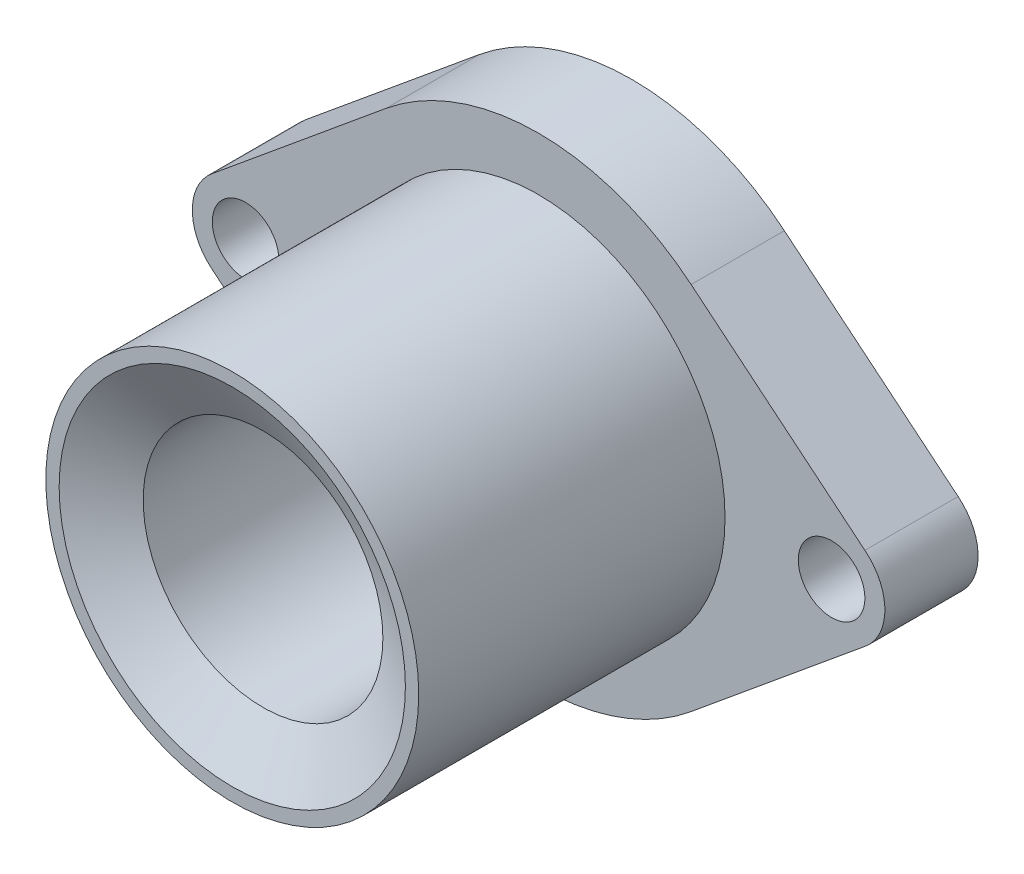
ISO-10303-21;
HEADER;
FILE_DESCRIPTION(('STEP AP214'),'2;1');
FILE_NAME('part.step','',(''),(''),'','','');
FILE_SCHEMA(('AUTOMOTIVE_DESIGN { 1 0 10303 214 1 1 1 1 }'));
ENDSEC;
DATA;
#1=APPLICATION_CONTEXT('core data for automotive mechanical design processes');
#2=APPLICATION_PROTOCOL_DEFINITION('international standard','automotive_design',2000,#1);
#3=PRODUCT_CONTEXT('',#1,'mechanical');
#4=PRODUCT('Part','Part','',(#3));
#5=PRODUCT_RELATED_PRODUCT_CATEGORY('part','',(#4));
#6=PRODUCT_DEFINITION_FORMATION('','',#4);
#7=PRODUCT_DEFINITION_CONTEXT('part definition',#1,'design');
#8=PRODUCT_DEFINITION('design','',#6,#7);
#9=PRODUCT_DEFINITION_SHAPE('','',#8);
#10=(LENGTH_UNIT() NAMED_UNIT(*) SI_UNIT(.MILLI.,.METRE.));
#11=(NAMED_UNIT(*) PLANE_ANGLE_UNIT() SI_UNIT($,.RADIAN.));
#12=(NAMED_UNIT(*) SI_UNIT($,.STERADIAN.) SOLID_ANGLE_UNIT());
#13=UNCERTAINTY_MEASURE_WITH_UNIT(LENGTH_MEASURE(1.E-05),#10,'distance_accuracy_value','');
#14=(GEOMETRIC_REPRESENTATION_CONTEXT(3) GLOBAL_UNCERTAINTY_ASSIGNED_CONTEXT((#13)) GLOBAL_UNIT_ASSIGNED_CONTEXT((#10,
#11,#12)) REPRESENTATION_CONTEXT('',''));
#15=CARTESIAN_POINT('',(0.,0.,0.));
#16=DIRECTION('',(0.,0.,1.));
#17=DIRECTION('',(1.,0.,0.));
#18=AXIS2_PLACEMENT_3D('',#15,#16,#17);
#19=CARTESIAN_POINT('',(11.4548975518976,13.8847154121188,7.));
#20=DIRECTION('',(-0.636383197327646,-0.771373078451046,0.));
#21=DIRECTION('',(0.771373078451046,-0.636383197327646,0.));
#22=AXIS2_PLACEMENT_3D('',#19,#20,#21);
#23=PLANE('',#22);
#24=DIRECTION('',(-0.771373078451046,0.636383197327646,0.));
#25=VECTOR('',#24,1.);
#26=CARTESIAN_POINT('',(11.4548975518976,13.8847154121188,0.));
#27=LINE('',#26,#25);
#28=CARTESIAN_POINT('',(24.500000000005,3.1224989991952,0.));
#29=VERTEX_POINT('',#28);
#30=CARTESIAN_POINT('',(11.4548975518976,13.8847154121188,0.));
#31=VERTEX_POINT('',#30);
#32=EDGE_CURVE('E144',#29,#31,#27,.T.);
#33=ORIENTED_EDGE('',*,*,#32,.T.);
#34=DIRECTION('',(0.,0.,-1.));
#35=VECTOR('',#34,1.);
#36=CARTESIAN_POINT('',(11.4548975518976,13.8847154121188,7.));
#37=LINE('',#36,#35);
#38=CARTESIAN_POINT('',(11.4548975518976,13.8847154121188,7.));
#39=VERTEX_POINT('',#38);
#40=EDGE_CURVE('E172',#39,#31,#37,.T.);
#41=ORIENTED_EDGE('',*,*,#40,.F.);
#42=DIRECTION('',(-0.771373078451046,0.636383197327646,0.));
#43=VECTOR('',#42,1.);
#44=CARTESIAN_POINT('',(11.4548975518976,13.8847154121188,7.));
#45=LINE('',#44,#43);
#46=CARTESIAN_POINT('',(24.500000000005,3.1224989991952,7.));
#47=VERTEX_POINT('',#46);
#48=EDGE_CURVE('E226',#47,#39,#45,.T.);
#49=ORIENTED_EDGE('',*,*,#48,.F.);
#50=DIRECTION('',(0.,0.,-1.));
#51=VECTOR('',#50,1.);
#52=CARTESIAN_POINT('',(24.500000000005,3.1224989991952,7.));
#53=LINE('',#52,#51);
#54=EDGE_CURVE('E133',#47,#29,#53,.T.);
#55=ORIENTED_EDGE('',*,*,#54,.T.);
#56=EDGE_LOOP('',(#33,#41,#49,#55));
#57=FACE_BOUND('',#56,.T.);
#58=ADVANCED_FACE('F39',(#57),#23,.F.);
#59=CARTESIAN_POINT('',(0.,0.,7.));
#60=DIRECTION('',(0.,0.,-1.));
#61=DIRECTION('',(-1.,0.,0.));
#62=AXIS2_PLACEMENT_3D('',#59,#60,#61);
#63=CYLINDRICAL_SURFACE('',#62,18.);
#64=CARTESIAN_POINT('',(0.,0.,0.));
#65=DIRECTION('',(0.,0.,1.));
#66=DIRECTION('',(1.,0.,0.));
#67=AXIS2_PLACEMENT_3D('',#64,#65,#66);
#68=CIRCLE('',#67,18.);
#69=CARTESIAN_POINT('',(-11.4548975518977,13.8847154121188,0.));
#70=VERTEX_POINT('',#69);
#71=EDGE_CURVE('E147',#31,#70,#68,.T.);
#72=ORIENTED_EDGE('',*,*,#71,.T.);
#73=DIRECTION('',(0.,0.,-1.));
#74=VECTOR('',#73,1.);
#75=CARTESIAN_POINT('',(-11.4548975518977,13.8847154121188,7.));
#76=LINE('',#75,#74);
#77=CARTESIAN_POINT('',(-11.4548975518977,13.8847154121188,7.));
#78=VERTEX_POINT('',#77);
#79=EDGE_CURVE('E170',#78,#70,#76,.T.);
#80=ORIENTED_EDGE('',*,*,#79,.F.);
#81=CARTESIAN_POINT('',(0.,0.,7.));
#82=DIRECTION('',(0.,0.,1.));
#83=DIRECTION('',(1.,0.,0.));
#84=AXIS2_PLACEMENT_3D('',#81,#82,#83);
#85=CIRCLE('',#84,18.);
#86=EDGE_CURVE('E97',#39,#78,#85,.T.);
#87=ORIENTED_EDGE('',*,*,#86,.F.);
#88=ORIENTED_EDGE('',*,*,#40,.T.);
#89=EDGE_LOOP('',(#72,#80,#87,#88));
#90=FACE_BOUND('',#89,.T.);
#91=ADVANCED_FACE('F190',(#90),#63,.T.);
#92=CARTESIAN_POINT('',(-11.4548975518977,13.8847154121188,7.));
#93=DIRECTION('',(-0.63638319732765,0.771373078451042,0.));
#94=DIRECTION('',(-0.771373078451042,-0.63638319732765,0.));
#95=AXIS2_PLACEMENT_3D('',#92,#93,#94);
#96=PLANE('',#95);
#97=DIRECTION('',(0.771373078451042,0.63638319732765,0.));
#98=VECTOR('',#97,1.);
#99=CARTESIAN_POINT('',(-11.4548975518977,13.8847154121188,0.));
#100=LINE('',#99,#98);
#101=CARTESIAN_POINT('',(-24.5,3.1224989991992,0.));
#102=VERTEX_POINT('',#101);
#103=EDGE_CURVE('E150',#102,#70,#100,.T.);
#104=ORIENTED_EDGE('',*,*,#103,.F.);
#105=DIRECTION('',(0.,0.,-1.));
#106=VECTOR('',#105,1.);
#107=CARTESIAN_POINT('',(-24.5,3.1224989991992,7.));
#108=LINE('',#107,#106);
#109=CARTESIAN_POINT('',(-24.5,3.1224989991992,7.));
#110=VERTEX_POINT('',#109);
#111=EDGE_CURVE('E168',#110,#102,#108,.T.);
#112=ORIENTED_EDGE('',*,*,#111,.F.);
#113=DIRECTION('',(0.771373078451042,0.63638319732765,0.));
#114=VECTOR('',#113,1.);
#115=CARTESIAN_POINT('',(-11.4548975518977,13.8847154121188,7.));
#116=LINE('',#115,#114);
#117=EDGE_CURVE('E229',#110,#78,#116,.T.);
#118=ORIENTED_EDGE('',*,*,#117,.T.);
#119=ORIENTED_EDGE('',*,*,#79,.T.);
#120=EDGE_LOOP('',(#104,#112,#118,#119));
#121=FACE_BOUND('',#120,.T.);
#122=ADVANCED_FACE('F196',(#121),#96,.T.);
#123=CARTESIAN_POINT('',(-22.,0.,7.));
#124=DIRECTION('',(0.,0.,-1.));
#125=DIRECTION('',(-1.,0.,0.));
#126=AXIS2_PLACEMENT_3D('',#123,#124,#125);
#127=CYLINDRICAL_SURFACE('',#126,4.);
#128=CARTESIAN_POINT('',(-22.,0.,0.));
#129=DIRECTION('',(0.,0.,1.));
#130=DIRECTION('',(1.,0.,0.));
#131=AXIS2_PLACEMENT_3D('',#128,#129,#130);
#132=CIRCLE('',#131,4.);
#133=CARTESIAN_POINT('',(-24.5,-3.1224989991992,0.));
#134=VERTEX_POINT('',#133);
#135=EDGE_CURVE('E153',#102,#134,#132,.T.);
#136=ORIENTED_EDGE('',*,*,#135,.T.);
#137=DIRECTION('',(0.,0.,-1.));
#138=VECTOR('',#137,1.);
#139=CARTESIAN_POINT('',(-24.5,-3.1224989991992,7.));
#140=LINE('',#139,#138);
#141=CARTESIAN_POINT('',(-24.5,-3.1224989991992,7.));
#142=VERTEX_POINT('',#141);
#143=EDGE_CURVE('E165',#142,#134,#140,.T.);
#144=ORIENTED_EDGE('',*,*,#143,.F.);
#145=CARTESIAN_POINT('',(-22.,0.,7.));
#146=DIRECTION('',(0.,0.,1.));
#147=DIRECTION('',(1.,0.,0.));
#148=AXIS2_PLACEMENT_3D('',#145,#146,#147);
#149=CIRCLE('',#148,4.);
#150=EDGE_CURVE('E237',#110,#142,#149,.T.);
#151=ORIENTED_EDGE('',*,*,#150,.F.);
#152=ORIENTED_EDGE('',*,*,#111,.T.);
#153=EDGE_LOOP('',(#136,#144,#151,#152));
#154=FACE_BOUND('',#153,.T.);
#155=ADVANCED_FACE('F242',(#154),#127,.T.);
#156=CARTESIAN_POINT('',(-11.4548975518977,-13.8847154121188,7.));
#157=DIRECTION('',(0.63638319732765,0.771373078451042,0.));
#158=DIRECTION('',(-0.771373078451042,0.63638319732765,0.));
#159=AXIS2_PLACEMENT_3D('',#156,#157,#158);
#160=PLANE('',#159);
#161=DIRECTION('',(0.771373078451042,-0.63638319732765,0.));
#162=VECTOR('',#161,1.);
#163=CARTESIAN_POINT('',(-11.4548975518977,-13.8847154121188,0.));
#164=LINE('',#163,#162);
#165=CARTESIAN_POINT('',(-11.4548975518977,-13.8847154121188,0.));
#166=VERTEX_POINT('',#165);
#167=EDGE_CURVE('E155',#134,#166,#164,.T.);
#168=ORIENTED_EDGE('',*,*,#167,.T.);
#169=DIRECTION('',(0.,0.,-1.));
#170=VECTOR('',#169,1.);
#171=CARTESIAN_POINT('',(-11.4548975518977,-13.8847154121188,7.));
#172=LINE('',#171,#170);
#173=CARTESIAN_POINT('',(-11.4548975518977,-13.8847154121188,7.));
#174=VERTEX_POINT('',#173);
#175=EDGE_CURVE('E129',#174,#166,#172,.T.);
#176=ORIENTED_EDGE('',*,*,#175,.F.);
#177=DIRECTION('',(0.771373078451042,-0.63638319732765,0.));
#178=VECTOR('',#177,1.);
#179=CARTESIAN_POINT('',(-11.4548975518977,-13.8847154121188,7.));
#180=LINE('',#179,#178);
#181=EDGE_CURVE('E116',#142,#174,#180,.T.);
#182=ORIENTED_EDGE('',*,*,#181,.F.);
#183=ORIENTED_EDGE('',*,*,#143,.T.);
#184=EDGE_LOOP('',(#168,#176,#182,#183));
#185=FACE_BOUND('',#184,.T.);
#186=ADVANCED_FACE('F246',(#185),#160,.F.);
#187=CARTESIAN_POINT('',(0.,0.,7.));
#188=DIRECTION('',(0.,0.,-1.));
#189=DIRECTION('',(-1.,0.,0.));
#190=AXIS2_PLACEMENT_3D('',#187,#188,#189);
#191=CYLINDRICAL_SURFACE('',#190,18.);
#192=CARTESIAN_POINT('',(0.,0.,0.));
#193=DIRECTION('',(0.,0.,1.));
#194=DIRECTION('',(1.,0.,0.));
#195=AXIS2_PLACEMENT_3D('',#192,#193,#194);
#196=CIRCLE('',#195,18.);
#197=CARTESIAN_POINT('',(11.4548975518976,-13.8847154121188,0.));
#198=VERTEX_POINT('',#197);
#199=EDGE_CURVE('E125',#166,#198,#196,.T.);
#200=ORIENTED_EDGE('',*,*,#199,.T.);
#201=DIRECTION('',(0.,0.,-1.));
#202=VECTOR('',#201,1.);
#203=CARTESIAN_POINT('',(11.4548975518976,-13.8847154121188,7.));
#204=LINE('',#203,#202);
#205=CARTESIAN_POINT('',(11.4548975518976,-13.8847154121188,7.));
#206=VERTEX_POINT('',#205);
#207=EDGE_CURVE('E122',#206,#198,#204,.T.);
#208=ORIENTED_EDGE('',*,*,#207,.F.);
#209=CARTESIAN_POINT('',(0.,0.,7.));
#210=DIRECTION('',(0.,0.,1.));
#211=DIRECTION('',(1.,0.,0.));
#212=AXIS2_PLACEMENT_3D('',#209,#210,#211);
#213=CIRCLE('',#212,18.);
#214=EDGE_CURVE('E110',#174,#206,#213,.T.);
#215=ORIENTED_EDGE('',*,*,#214,.F.);
#216=ORIENTED_EDGE('',*,*,#175,.T.);
#217=EDGE_LOOP('',(#200,#208,#215,#216));
#218=FACE_BOUND('',#217,.T.);
#219=ADVANCED_FACE('F123',(#218),#191,.T.);
#220=CARTESIAN_POINT('',(11.4548975518976,-13.8847154121188,7.));
#221=DIRECTION('',(0.636383197327646,-0.771373078451046,0.));
#222=DIRECTION('',(0.771373078451046,0.636383197327646,0.));
#223=AXIS2_PLACEMENT_3D('',#220,#221,#222);
#224=PLANE('',#223);
#225=DIRECTION('',(-0.771373078451046,-0.636383197327646,0.));
#226=VECTOR('',#225,1.);
#227=CARTESIAN_POINT('',(11.4548975518976,-13.8847154121188,0.));
#228=LINE('',#227,#226);
#229=CARTESIAN_POINT('',(24.500000000005,-3.1224989991952,0.));
#230=VERTEX_POINT('',#229);
#231=EDGE_CURVE('E158',#230,#198,#228,.T.);
#232=ORIENTED_EDGE('',*,*,#231,.F.);
#233=DIRECTION('',(0.,0.,-1.));
#234=VECTOR('',#233,1.);
#235=CARTESIAN_POINT('',(24.500000000005,-3.1224989991952,7.));
#236=LINE('',#235,#234);
#237=CARTESIAN_POINT('',(24.500000000005,-3.1224989991952,7.));
#238=VERTEX_POINT('',#237);
#239=EDGE_CURVE('E85',#238,#230,#236,.T.);
#240=ORIENTED_EDGE('',*,*,#239,.F.);
#241=DIRECTION('',(-0.771373078451046,-0.636383197327646,0.));
#242=VECTOR('',#241,1.);
#243=CARTESIAN_POINT('',(11.4548975518976,-13.8847154121188,7.));
#244=LINE('',#243,#242);
#245=EDGE_CURVE('E114',#238,#206,#244,.T.);
#246=ORIENTED_EDGE('',*,*,#245,.T.);
#247=ORIENTED_EDGE('',*,*,#207,.T.);
#248=EDGE_LOOP('',(#232,#240,#246,#247));
#249=FACE_BOUND('',#248,.T.);
#250=ADVANCED_FACE('F131',(#249),#224,.T.);
#251=CARTESIAN_POINT('',(22.,0.,7.));
#252=DIRECTION('',(0.,0.,-1.));
#253=DIRECTION('',(-1.,0.,0.));
#254=AXIS2_PLACEMENT_3D('',#251,#252,#253);
#255=CYLINDRICAL_SURFACE('',#254,2.5);
#256=CARTESIAN_POINT('',(22.,0.,7.));
#257=DIRECTION('',(0.,0.,1.));
#258=DIRECTION('',(1.,0.,0.));
#259=AXIS2_PLACEMENT_3D('',#256,#257,#258);
#260=CIRCLE('',#259,2.5);
#261=CARTESIAN_POINT('',(24.5,0.,7.));
#262=VERTEX_POINT('',#261);
#263=EDGE_CURVE('E227',#262,#262,#260,.T.);
#264=ORIENTED_EDGE('',*,*,#263,.T.);
#265=EDGE_LOOP('',(#264));
#266=FACE_BOUND('',#265,.T.);
#267=CARTESIAN_POINT('',(22.,0.,0.));
#268=DIRECTION('',(0.,0.,1.));
#269=DIRECTION('',(1.,0.,0.));
#270=AXIS2_PLACEMENT_3D('',#267,#268,#269);
#271=CIRCLE('',#270,2.5);
#272=CARTESIAN_POINT('',(24.5,0.,0.));
#273=VERTEX_POINT('',#272);
#274=EDGE_CURVE('E140',#273,#273,#271,.T.);
#275=ORIENTED_EDGE('',*,*,#274,.F.);
#276=EDGE_LOOP('',(#275));
#277=FACE_BOUND('',#276,.T.);
#278=ADVANCED_FACE('F200',(#266,#277),#255,.F.);
#279=CARTESIAN_POINT('',(-22.,0.,7.));
#280=DIRECTION('',(0.,0.,-1.));
#281=DIRECTION('',(-1.,0.,0.));
#282=AXIS2_PLACEMENT_3D('',#279,#280,#281);
#283=CYLINDRICAL_SURFACE('',#282,2.5);
#284=CARTESIAN_POINT('',(-22.,0.,7.));
#285=DIRECTION('',(0.,0.,1.));
#286=DIRECTION('',(1.,0.,0.));
#287=AXIS2_PLACEMENT_3D('',#284,#285,#286);
#288=CIRCLE('',#287,2.5);
#289=CARTESIAN_POINT('',(-19.5,0.,7.));
#290=VERTEX_POINT('',#289);
#291=EDGE_CURVE('E161',#290,#290,#288,.T.);
#292=ORIENTED_EDGE('',*,*,#291,.T.);
#293=EDGE_LOOP('',(#292));
#294=FACE_BOUND('',#293,.T.);
#295=CARTESIAN_POINT('',(-22.,0.,0.));
#296=DIRECTION('',(0.,0.,1.));
#297=DIRECTION('',(1.,0.,0.));
#298=AXIS2_PLACEMENT_3D('',#295,#296,#297);
#299=CIRCLE('',#298,2.5);
#300=CARTESIAN_POINT('',(-19.5,0.,0.));
#301=VERTEX_POINT('',#300);
#302=EDGE_CURVE('E137',#301,#301,#299,.T.);
#303=ORIENTED_EDGE('',*,*,#302,.F.);
#304=EDGE_LOOP('',(#303));
#305=FACE_BOUND('',#304,.T.);
#306=ADVANCED_FACE('F202',(#294,#305),#283,.F.);
#307=CARTESIAN_POINT('',(22.,0.,7.));
#308=DIRECTION('',(0.,0.,-1.));
#309=DIRECTION('',(-1.,0.,0.));
#310=AXIS2_PLACEMENT_3D('',#307,#308,#309);
#311=CYLINDRICAL_SURFACE('',#310,4.);
#312=CARTESIAN_POINT('',(22.,0.,0.));
#313=DIRECTION('',(0.,0.,1.));
#314=DIRECTION('',(1.,0.,0.));
#315=AXIS2_PLACEMENT_3D('',#312,#313,#314);
#316=CIRCLE('',#315,4.);
#317=EDGE_CURVE('E88',#230,#29,#316,.T.);
#318=ORIENTED_EDGE('',*,*,#317,.T.);
#319=ORIENTED_EDGE('',*,*,#54,.F.);
#320=CARTESIAN_POINT('',(22.,0.,7.));
#321=DIRECTION('',(0.,0.,1.));
#322=DIRECTION('',(1.,0.,0.));
#323=AXIS2_PLACEMENT_3D('',#320,#321,#322);
#324=CIRCLE('',#323,4.);
#325=EDGE_CURVE('E57',#238,#47,#324,.T.);
#326=ORIENTED_EDGE('',*,*,#325,.F.);
#327=ORIENTED_EDGE('',*,*,#239,.T.);
#328=EDGE_LOOP('',(#318,#319,#326,#327));
#329=FACE_BOUND('',#328,.T.);
#330=ADVANCED_FACE('F205',(#329),#311,.T.);
#331=CARTESIAN_POINT('',(0.,0.,7.));
#332=DIRECTION('',(0.,0.,1.));
#333=DIRECTION('',(1.,0.,0.));
#334=AXIS2_PLACEMENT_3D('',#331,#332,#333);
#335=PLANE('',#334);
#336=CARTESIAN_POINT('',(0.,0.,7.));
#337=DIRECTION('',(0.,0.,1.));
#338=DIRECTION('',(1.,0.,0.));
#339=AXIS2_PLACEMENT_3D('',#336,#337,#338);
#340=CIRCLE('',#339,14.);
#341=CARTESIAN_POINT('',(14.,0.,7.));
#342=VERTEX_POINT('',#341);
#343=EDGE_CURVE('E141',#342,#342,#340,.F.);
#344=ORIENTED_EDGE('',*,*,#343,.T.);
#345=EDGE_LOOP('',(#344));
#346=FACE_BOUND('',#345,.T.);
#347=ORIENTED_EDGE('',*,*,#291,.F.);
#348=EDGE_LOOP('',(#347));
#349=FACE_BOUND('',#348,.T.);
#350=ORIENTED_EDGE('',*,*,#263,.F.);
#351=EDGE_LOOP('',(#350));
#352=FACE_BOUND('',#351,.T.);
#353=ORIENTED_EDGE('',*,*,#48,.T.);
#354=ORIENTED_EDGE('',*,*,#86,.T.);
#355=ORIENTED_EDGE('',*,*,#117,.F.);
#356=ORIENTED_EDGE('',*,*,#150,.T.);
#357=ORIENTED_EDGE('',*,*,#181,.T.);
#358=ORIENTED_EDGE('',*,*,#214,.T.);
#359=ORIENTED_EDGE('',*,*,#245,.F.);
#360=ORIENTED_EDGE('',*,*,#325,.T.);
#361=EDGE_LOOP('',(#353,#354,#355,#356,#357,#358,#359,#360));
#362=FACE_BOUND('',#361,.T.);
#363=ADVANCED_FACE('F112',(#346,#349,#352,#362),#335,.T.);
#364=CARTESIAN_POINT('',(0.,0.,0.));
#365=DIRECTION('',(0.,0.,1.));
#366=DIRECTION('',(1.,0.,0.));
#367=AXIS2_PLACEMENT_3D('',#364,#365,#366);
#368=PLANE('',#367);
#369=CARTESIAN_POINT('',(0.,0.,0.));
#370=DIRECTION('',(0.,0.,1.));
#371=DIRECTION('',(1.,0.,0.));
#372=AXIS2_PLACEMENT_3D('',#369,#370,#371);
#373=CIRCLE('',#372,9.);
#374=CARTESIAN_POINT('',(9.,0.,0.));
#375=VERTEX_POINT('',#374);
#376=EDGE_CURVE('E277',#375,#375,#373,.T.);
#377=ORIENTED_EDGE('',*,*,#376,.T.);
#378=EDGE_LOOP('',(#377));
#379=FACE_BOUND('',#378,.T.);
#380=ORIENTED_EDGE('',*,*,#302,.T.);
#381=EDGE_LOOP('',(#380));
#382=FACE_BOUND('',#381,.T.);
#383=ORIENTED_EDGE('',*,*,#274,.T.);
#384=EDGE_LOOP('',(#383));
#385=FACE_BOUND('',#384,.T.);
#386=ORIENTED_EDGE('',*,*,#32,.F.);
#387=ORIENTED_EDGE('',*,*,#317,.F.);
#388=ORIENTED_EDGE('',*,*,#231,.T.);
#389=ORIENTED_EDGE('',*,*,#199,.F.);
#390=ORIENTED_EDGE('',*,*,#167,.F.);
#391=ORIENTED_EDGE('',*,*,#135,.F.);
#392=ORIENTED_EDGE('',*,*,#103,.T.);
#393=ORIENTED_EDGE('',*,*,#71,.F.);
#394=EDGE_LOOP('',(#386,#387,#388,#389,#390,#391,#392,#393));
#395=FACE_BOUND('',#394,.T.);
#396=ADVANCED_FACE('F216',(#379,#382,#385,#395),#368,.F.);
#397=CARTESIAN_POINT('',(0.,0.,30.));
#398=DIRECTION('',(0.,0.,-1.));
#399=DIRECTION('',(-1.,0.,0.));
#400=AXIS2_PLACEMENT_3D('',#397,#398,#399);
#401=CYLINDRICAL_SURFACE('',#400,9.);
#402=CARTESIAN_POINT('',(0.,0.,27.6905989232415));
#403=DIRECTION('',(0.,0.,1.));
#404=DIRECTION('',(1.,0.,0.));
#405=AXIS2_PLACEMENT_3D('',#402,#403,#404);
#406=CIRCLE('',#405,9.);
#407=CARTESIAN_POINT('',(9.,0.,27.6905989232415));
#408=VERTEX_POINT('',#407);
#409=EDGE_CURVE('E49',#408,#408,#406,.T.);
#410=ORIENTED_EDGE('',*,*,#409,.T.);
#411=EDGE_LOOP('',(#410));
#412=FACE_BOUND('',#411,.T.);
#413=ORIENTED_EDGE('',*,*,#376,.F.);
#414=EDGE_LOOP('',(#413));
#415=FACE_BOUND('',#414,.T.);
#416=ADVANCED_FACE('F176',(#412,#415),#401,.F.);
#417=CARTESIAN_POINT('',(0.,0.,30.));
#418=DIRECTION('',(0.,0.,-1.));
#419=DIRECTION('',(-1.,0.,0.));
#420=AXIS2_PLACEMENT_3D('',#417,#418,#419);
#421=CYLINDRICAL_SURFACE('',#420,14.);
#422=ORIENTED_EDGE('',*,*,#343,.F.);
#423=EDGE_LOOP('',(#422));
#424=FACE_BOUND('',#423,.T.);
#425=CARTESIAN_POINT('',(0.,0.,30.));
#426=DIRECTION('',(0.,0.,1.));
#427=DIRECTION('',(1.,0.,0.));
#428=AXIS2_PLACEMENT_3D('',#425,#426,#427);
#429=CIRCLE('',#428,14.);
#430=CARTESIAN_POINT('',(14.,0.,30.));
#431=VERTEX_POINT('',#430);
#432=EDGE_CURVE('E275',#431,#431,#429,.T.);
#433=ORIENTED_EDGE('',*,*,#432,.F.);
#434=EDGE_LOOP('',(#433));
#435=FACE_BOUND('',#434,.T.);
#436=ADVANCED_FACE('F185',(#424,#435),#421,.T.);
#437=CARTESIAN_POINT('',(0.,0.,30.));
#438=DIRECTION('',(0.,0.,1.));
#439=DIRECTION('',(1.,0.,0.));
#440=AXIS2_PLACEMENT_3D('',#437,#438,#439);
#441=PLANE('',#440);
#442=CARTESIAN_POINT('',(0.,0.,30.));
#443=DIRECTION('',(0.,0.,1.));
#444=DIRECTION('',(1.,0.,0.));
#445=AXIS2_PLACEMENT_3D('',#442,#443,#444);
#446=CIRCLE('',#445,13.);
#447=CARTESIAN_POINT('',(13.,0.,30.));
#448=VERTEX_POINT('',#447);
#449=EDGE_CURVE('E11',#448,#448,#446,.F.);
#450=ORIENTED_EDGE('',*,*,#449,.T.);
#451=EDGE_LOOP('',(#450));
#452=FACE_BOUND('',#451,.T.);
#453=ORIENTED_EDGE('',*,*,#432,.T.);
#454=EDGE_LOOP('',(#453));
#455=FACE_BOUND('',#454,.T.);
#456=ADVANCED_FACE('F180',(#452,#455),#441,.T.);
#457=CARTESIAN_POINT('',(0.,0.,27.6905989232415));
#458=DIRECTION('',(0.,0.,1.));
#459=DIRECTION('',(1.,0.,0.));
#460=AXIS2_PLACEMENT_3D('',#457,#458,#459);
#461=CONICAL_SURFACE('',#460,9.,1.0471975511966);
#462=ORIENTED_EDGE('',*,*,#449,.F.);
#463=EDGE_LOOP('',(#462));
#464=FACE_BOUND('',#463,.T.);
#465=ORIENTED_EDGE('',*,*,#409,.F.);
#466=EDGE_LOOP('',(#465));
#467=FACE_BOUND('',#466,.T.);
#468=ADVANCED_FACE('F42',(#464,#467),#461,.F.);
#469=CLOSED_SHELL('',(#58,#91,#122,#155,#186,#219,#250,#278,#306,#330,#363,#396,#416,#436,#456,#468));
#470=MANIFOLD_SOLID_BREP('B2',#469);
#471=ADVANCED_BREP_SHAPE_REPRESENTATION('',(#18,#470),#14);
#472=SHAPE_DEFINITION_REPRESENTATION(#9,#471);
ENDSEC;
END-ISO-10303-21;
